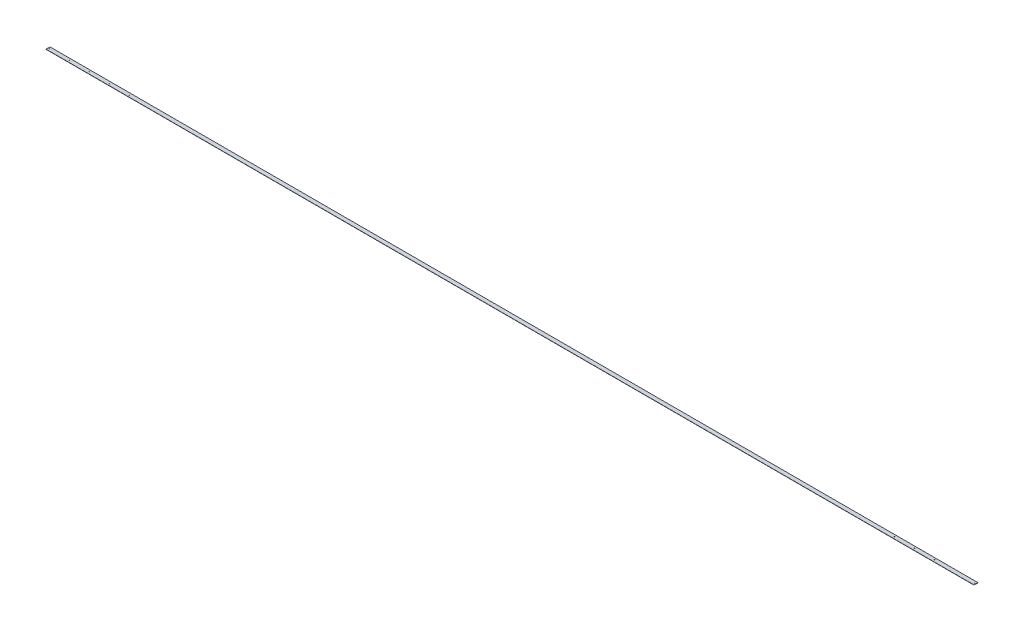
ISO-10303-21;
HEADER;
FILE_DESCRIPTION(('STEP AP214'),'2;1');
FILE_NAME('part.step','',(''),(''),'','','');
FILE_SCHEMA(('AUTOMOTIVE_DESIGN { 1 0 10303 214 1 1 1 1 }'));
ENDSEC;
DATA;
#1=APPLICATION_CONTEXT('core data for automotive mechanical design processes');
#2=APPLICATION_PROTOCOL_DEFINITION('international standard','automotive_design',2000,#1);
#3=PRODUCT_CONTEXT('',#1,'mechanical');
#4=PRODUCT('Part','Part','',(#3));
#5=PRODUCT_RELATED_PRODUCT_CATEGORY('part','',(#4));
#6=PRODUCT_DEFINITION_FORMATION('','',#4);
#7=PRODUCT_DEFINITION_CONTEXT('part definition',#1,'design');
#8=PRODUCT_DEFINITION('design','',#6,#7);
#9=PRODUCT_DEFINITION_SHAPE('','',#8);
#10=(LENGTH_UNIT() NAMED_UNIT(*) SI_UNIT(.MILLI.,.METRE.));
#11=(NAMED_UNIT(*) PLANE_ANGLE_UNIT() SI_UNIT($,.RADIAN.));
#12=(NAMED_UNIT(*) SI_UNIT($,.STERADIAN.) SOLID_ANGLE_UNIT());
#13=UNCERTAINTY_MEASURE_WITH_UNIT(LENGTH_MEASURE(1.E-05),#10,'distance_accuracy_value','');
#14=(GEOMETRIC_REPRESENTATION_CONTEXT(3) GLOBAL_UNCERTAINTY_ASSIGNED_CONTEXT((#13)) GLOBAL_UNIT_ASSIGNED_CONTEXT((#10,
#11,#12)) REPRESENTATION_CONTEXT('',''));
#15=CARTESIAN_POINT('',(0.,0.,0.));
#16=DIRECTION('',(0.,0.,1.));
#17=DIRECTION('',(1.,0.,0.));
#18=AXIS2_PLACEMENT_3D('',#15,#16,#17);
#19=CARTESIAN_POINT('',(-4925.,2.,21.0000000000006));
#20=DIRECTION('',(1.,0.,0.));
#21=DIRECTION('',(0.,0.,-1.));
#22=AXIS2_PLACEMENT_3D('',#19,#20,#21);
#23=PLANE('',#22);
#24=DIRECTION('',(0.,0.,1.));
#25=VECTOR('',#24,1.);
#26=CARTESIAN_POINT('',(-4925.,0.,21.0000000000006));
#27=LINE('',#26,#25);
#28=CARTESIAN_POINT('',(-4925.,0.,-20.9999999999994));
#29=VERTEX_POINT('',#28);
#30=CARTESIAN_POINT('',(-4925.,0.,21.0000000000006));
#31=VERTEX_POINT('',#30);
#32=EDGE_CURVE('E110',#29,#31,#27,.T.);
#33=ORIENTED_EDGE('',*,*,#32,.T.);
#34=DIRECTION('',(0.,-1.,0.));
#35=VECTOR('',#34,1.);
#36=CARTESIAN_POINT('',(-4925.,2.,21.0000000000006));
#37=LINE('',#36,#35);
#38=CARTESIAN_POINT('',(-4925.,2.,21.0000000000006));
#39=VERTEX_POINT('',#38);
#40=EDGE_CURVE('E11',#39,#31,#37,.T.);
#41=ORIENTED_EDGE('',*,*,#40,.F.);
#42=DIRECTION('',(0.,0.,1.));
#43=VECTOR('',#42,1.);
#44=CARTESIAN_POINT('',(-4925.,2.,21.0000000000006));
#45=LINE('',#44,#43);
#46=CARTESIAN_POINT('',(-4925.,2.,-20.9999999999994));
#47=VERTEX_POINT('',#46);
#48=EDGE_CURVE('E93',#47,#39,#45,.T.);
#49=ORIENTED_EDGE('',*,*,#48,.F.);
#50=DIRECTION('',(0.,-1.,0.));
#51=VECTOR('',#50,1.);
#52=CARTESIAN_POINT('',(-4925.,2.,-20.9999999999994));
#53=LINE('',#52,#51);
#54=EDGE_CURVE('E106',#47,#29,#53,.T.);
#55=ORIENTED_EDGE('',*,*,#54,.T.);
#56=EDGE_LOOP('',(#33,#41,#49,#55));
#57=FACE_BOUND('',#56,.T.);
#58=ADVANCED_FACE('F39',(#57),#23,.F.);
#59=CARTESIAN_POINT('',(4925.,2.,20.9999999999994));
#60=DIRECTION('',(0.,0.,-1.));
#61=DIRECTION('',(-1.,0.,0.));
#62=AXIS2_PLACEMENT_3D('',#59,#60,#61);
#63=PLANE('',#62);
#64=DIRECTION('',(1.,0.,0.));
#65=VECTOR('',#64,1.);
#66=CARTESIAN_POINT('',(4925.,0.,20.9999999999994));
#67=LINE('',#66,#65);
#68=CARTESIAN_POINT('',(4925.,0.,20.9999999999994));
#69=VERTEX_POINT('',#68);
#70=EDGE_CURVE('E98',#31,#69,#67,.T.);
#71=ORIENTED_EDGE('',*,*,#70,.T.);
#72=DIRECTION('',(0.,-1.,0.));
#73=VECTOR('',#72,1.);
#74=CARTESIAN_POINT('',(4925.,2.,20.9999999999994));
#75=LINE('',#74,#73);
#76=CARTESIAN_POINT('',(4925.,2.,20.9999999999994));
#77=VERTEX_POINT('',#76);
#78=EDGE_CURVE('E49',#77,#69,#75,.T.);
#79=ORIENTED_EDGE('',*,*,#78,.F.);
#80=DIRECTION('',(1.,0.,0.));
#81=VECTOR('',#80,1.);
#82=CARTESIAN_POINT('',(4925.,2.,20.9999999999994));
#83=LINE('',#82,#81);
#84=EDGE_CURVE('E88',#39,#77,#83,.T.);
#85=ORIENTED_EDGE('',*,*,#84,.F.);
#86=ORIENTED_EDGE('',*,*,#40,.T.);
#87=EDGE_LOOP('',(#71,#79,#85,#86));
#88=FACE_BOUND('',#87,.T.);
#89=ADVANCED_FACE('F97',(#88),#63,.F.);
#90=CARTESIAN_POINT('',(4925.,2.,20.9999999999994));
#91=DIRECTION('',(-1.,0.,0.));
#92=DIRECTION('',(0.,0.,1.));
#93=AXIS2_PLACEMENT_3D('',#90,#91,#92);
#94=PLANE('',#93);
#95=DIRECTION('',(0.,0.,-1.));
#96=VECTOR('',#95,1.);
#97=CARTESIAN_POINT('',(4925.,0.,20.9999999999994));
#98=LINE('',#97,#96);
#99=CARTESIAN_POINT('',(4925.,0.,-21.0000000000006));
#100=VERTEX_POINT('',#99);
#101=EDGE_CURVE('E75',#69,#100,#98,.T.);
#102=ORIENTED_EDGE('',*,*,#101,.T.);
#103=DIRECTION('',(0.,-1.,0.));
#104=VECTOR('',#103,1.);
#105=CARTESIAN_POINT('',(4925.,2.,-21.0000000000006));
#106=LINE('',#105,#104);
#107=CARTESIAN_POINT('',(4925.,2.,-21.0000000000006));
#108=VERTEX_POINT('',#107);
#109=EDGE_CURVE('E100',#108,#100,#106,.T.);
#110=ORIENTED_EDGE('',*,*,#109,.F.);
#111=DIRECTION('',(0.,0.,-1.));
#112=VECTOR('',#111,1.);
#113=CARTESIAN_POINT('',(4925.,2.,20.9999999999994));
#114=LINE('',#113,#112);
#115=EDGE_CURVE('E91',#77,#108,#114,.T.);
#116=ORIENTED_EDGE('',*,*,#115,.F.);
#117=ORIENTED_EDGE('',*,*,#78,.T.);
#118=EDGE_LOOP('',(#102,#110,#116,#117));
#119=FACE_BOUND('',#118,.T.);
#120=ADVANCED_FACE('F102',(#119),#94,.F.);
#121=CARTESIAN_POINT('',(4925.,2.,-21.0000000000006));
#122=DIRECTION('',(0.,0.,1.));
#123=DIRECTION('',(1.,0.,0.));
#124=AXIS2_PLACEMENT_3D('',#121,#122,#123);
#125=PLANE('',#124);
#126=DIRECTION('',(-1.,0.,0.));
#127=VECTOR('',#126,1.);
#128=CARTESIAN_POINT('',(4925.,0.,-21.0000000000006));
#129=LINE('',#128,#127);
#130=EDGE_CURVE('E81',#100,#29,#129,.T.);
#131=ORIENTED_EDGE('',*,*,#130,.T.);
#132=ORIENTED_EDGE('',*,*,#54,.F.);
#133=DIRECTION('',(-1.,0.,0.));
#134=VECTOR('',#133,1.);
#135=CARTESIAN_POINT('',(4925.,2.,-21.0000000000006));
#136=LINE('',#135,#134);
#137=EDGE_CURVE('E58',#108,#47,#136,.T.);
#138=ORIENTED_EDGE('',*,*,#137,.F.);
#139=ORIENTED_EDGE('',*,*,#109,.T.);
#140=EDGE_LOOP('',(#131,#132,#138,#139));
#141=FACE_BOUND('',#140,.T.);
#142=ADVANCED_FACE('F196',(#141),#125,.F.);
#143=CARTESIAN_POINT('',(0.,2.,0.));
#144=DIRECTION('',(0.,1.,0.));
#145=DIRECTION('',(0.,0.,1.));
#146=AXIS2_PLACEMENT_3D('',#143,#144,#145);
#147=PLANE('',#146);
#148=CARTESIAN_POINT('',(-4910.,2.,1.00000000000061));
#149=DIRECTION('',(0.,1.,0.));
#150=DIRECTION('',(0.,0.,1.));
#151=AXIS2_PLACEMENT_3D('',#148,#149,#150);
#152=CIRCLE('',#151,3.40000000000035);
#153=CARTESIAN_POINT('',(-4910.,2.,4.40000000000096));
#154=VERTEX_POINT('',#153);
#155=EDGE_CURVE('E129',#154,#154,#152,.T.);
#156=ORIENTED_EDGE('',*,*,#155,.F.);
#157=EDGE_LOOP('',(#156));
#158=FACE_BOUND('',#157,.T.);
#159=CARTESIAN_POINT('',(4060.,2.,1.00000000000654));
#160=DIRECTION('',(0.,1.,0.));
#161=DIRECTION('',(0.,0.,1.));
#162=AXIS2_PLACEMENT_3D('',#159,#160,#161);
#163=CIRCLE('',#162,3.40000000000035);
#164=CARTESIAN_POINT('',(4060.,2.,4.40000000000689));
#165=VERTEX_POINT('',#164);
#166=EDGE_CURVE('E337',#165,#165,#163,.T.);
#167=ORIENTED_EDGE('',*,*,#166,.F.);
#168=EDGE_LOOP('',(#167));
#169=FACE_BOUND('',#168,.T.);
#170=CARTESIAN_POINT('',(4272.5,2.,1.00000000000506));
#171=DIRECTION('',(0.,1.,0.));
#172=DIRECTION('',(0.,0.,1.));
#173=AXIS2_PLACEMENT_3D('',#170,#171,#172);
#174=CIRCLE('',#173,3.40000000000035);
#175=CARTESIAN_POINT('',(4272.5,2.,4.40000000000541));
#176=VERTEX_POINT('',#175);
#177=EDGE_CURVE('E310',#176,#176,#174,.T.);
#178=ORIENTED_EDGE('',*,*,#177,.F.);
#179=EDGE_LOOP('',(#178));
#180=FACE_BOUND('',#179,.T.);
#181=CARTESIAN_POINT('',(4485.,2.,1.00000000000358));
#182=DIRECTION('',(0.,1.,0.));
#183=DIRECTION('',(0.,0.,1.));
#184=AXIS2_PLACEMENT_3D('',#181,#182,#183);
#185=CIRCLE('',#184,3.40000000000035);
#186=CARTESIAN_POINT('',(4485.,2.,4.40000000000393));
#187=VERTEX_POINT('',#186);
#188=EDGE_CURVE('E336',#187,#187,#185,.T.);
#189=ORIENTED_EDGE('',*,*,#188,.F.);
#190=EDGE_LOOP('',(#189));
#191=FACE_BOUND('',#190,.T.);
#192=CARTESIAN_POINT('',(4697.5,2.,1.00000000000209));
#193=DIRECTION('',(0.,1.,0.));
#194=DIRECTION('',(0.,0.,1.));
#195=AXIS2_PLACEMENT_3D('',#192,#193,#194);
#196=CIRCLE('',#195,3.40000000000035);
#197=CARTESIAN_POINT('',(4697.5,2.,4.40000000000244));
#198=VERTEX_POINT('',#197);
#199=EDGE_CURVE('E342',#198,#198,#196,.T.);
#200=ORIENTED_EDGE('',*,*,#199,.F.);
#201=EDGE_LOOP('',(#200));
#202=FACE_BOUND('',#201,.T.);
#203=CARTESIAN_POINT('',(4910.,2.,1.00000000000061));
#204=DIRECTION('',(0.,1.,0.));
#205=DIRECTION('',(0.,0.,1.));
#206=AXIS2_PLACEMENT_3D('',#203,#204,#205);
#207=CIRCLE('',#206,3.40000000000035);
#208=CARTESIAN_POINT('',(4910.,2.,4.40000000000096));
#209=VERTEX_POINT('',#208);
#210=EDGE_CURVE('E351',#209,#209,#207,.T.);
#211=ORIENTED_EDGE('',*,*,#210,.F.);
#212=EDGE_LOOP('',(#211));
#213=FACE_BOUND('',#212,.T.);
#214=CARTESIAN_POINT('',(-4060.,2.,1.00000000000061));
#215=DIRECTION('',(0.,1.,0.));
#216=DIRECTION('',(0.,0.,1.));
#217=AXIS2_PLACEMENT_3D('',#214,#215,#216);
#218=CIRCLE('',#217,3.40000000000035);
#219=CARTESIAN_POINT('',(-4060.,2.,4.40000000000096));
#220=VERTEX_POINT('',#219);
#221=EDGE_CURVE('E355',#220,#220,#218,.T.);
#222=ORIENTED_EDGE('',*,*,#221,.F.);
#223=EDGE_LOOP('',(#222));
#224=FACE_BOUND('',#223,.T.);
#225=CARTESIAN_POINT('',(-4272.5,2.,1.00000000000061));
#226=DIRECTION('',(0.,1.,0.));
#227=DIRECTION('',(0.,0.,1.));
#228=AXIS2_PLACEMENT_3D('',#225,#226,#227);
#229=CIRCLE('',#228,3.40000000000035);
#230=CARTESIAN_POINT('',(-4272.5,2.,4.40000000000096));
#231=VERTEX_POINT('',#230);
#232=EDGE_CURVE('E359',#231,#231,#229,.T.);
#233=ORIENTED_EDGE('',*,*,#232,.F.);
#234=EDGE_LOOP('',(#233));
#235=FACE_BOUND('',#234,.T.);
#236=CARTESIAN_POINT('',(-4485.,2.,1.00000000000061));
#237=DIRECTION('',(0.,1.,0.));
#238=DIRECTION('',(0.,0.,1.));
#239=AXIS2_PLACEMENT_3D('',#236,#237,#238);
#240=CIRCLE('',#239,3.40000000000035);
#241=CARTESIAN_POINT('',(-4485.,2.,4.40000000000096));
#242=VERTEX_POINT('',#241);
#243=EDGE_CURVE('E363',#242,#242,#240,.T.);
#244=ORIENTED_EDGE('',*,*,#243,.F.);
#245=EDGE_LOOP('',(#244));
#246=FACE_BOUND('',#245,.T.);
#247=CARTESIAN_POINT('',(-4697.5,2.,1.00000000000061));
#248=DIRECTION('',(0.,1.,0.));
#249=DIRECTION('',(0.,0.,1.));
#250=AXIS2_PLACEMENT_3D('',#247,#248,#249);
#251=CIRCLE('',#250,3.40000000000035);
#252=CARTESIAN_POINT('',(-4697.5,2.,4.40000000000096));
#253=VERTEX_POINT('',#252);
#254=EDGE_CURVE('E367',#253,#253,#251,.T.);
#255=ORIENTED_EDGE('',*,*,#254,.F.);
#256=EDGE_LOOP('',(#255));
#257=FACE_BOUND('',#256,.T.);
#258=ORIENTED_EDGE('',*,*,#48,.T.);
#259=ORIENTED_EDGE('',*,*,#84,.T.);
#260=ORIENTED_EDGE('',*,*,#115,.T.);
#261=ORIENTED_EDGE('',*,*,#137,.T.);
#262=EDGE_LOOP('',(#258,#259,#260,#261));
#263=FACE_BOUND('',#262,.T.);
#264=ADVANCED_FACE('F89',(#158,#169,#180,#191,#202,#213,#224,#235,#246,#257,#263),#147,.T.);
#265=CARTESIAN_POINT('',(0.,0.,0.));
#266=DIRECTION('',(0.,1.,0.));
#267=DIRECTION('',(0.,0.,1.));
#268=AXIS2_PLACEMENT_3D('',#265,#266,#267);
#269=PLANE('',#268);
#270=CARTESIAN_POINT('',(-4910.,0.,1.00000000000061));
#271=DIRECTION('',(0.,1.,0.));
#272=DIRECTION('',(0.,0.,1.));
#273=AXIS2_PLACEMENT_3D('',#270,#271,#272);
#274=CIRCLE('',#273,3.40000000000035);
#275=CARTESIAN_POINT('',(-4910.,0.,4.40000000000096));
#276=VERTEX_POINT('',#275);
#277=EDGE_CURVE('E42',#276,#276,#274,.T.);
#278=ORIENTED_EDGE('',*,*,#277,.T.);
#279=EDGE_LOOP('',(#278));
#280=FACE_BOUND('',#279,.T.);
#281=CARTESIAN_POINT('',(4060.,0.,1.00000000000654));
#282=DIRECTION('',(0.,1.,0.));
#283=DIRECTION('',(0.,0.,1.));
#284=AXIS2_PLACEMENT_3D('',#281,#282,#283);
#285=CIRCLE('',#284,3.40000000000035);
#286=CARTESIAN_POINT('',(4060.,0.,4.40000000000689));
#287=VERTEX_POINT('',#286);
#288=EDGE_CURVE('E156',#287,#287,#285,.T.);
#289=ORIENTED_EDGE('',*,*,#288,.T.);
#290=EDGE_LOOP('',(#289));
#291=FACE_BOUND('',#290,.T.);
#292=CARTESIAN_POINT('',(4272.5,0.,1.00000000000506));
#293=DIRECTION('',(0.,1.,0.));
#294=DIRECTION('',(0.,0.,1.));
#295=AXIS2_PLACEMENT_3D('',#292,#293,#294);
#296=CIRCLE('',#295,3.40000000000035);
#297=CARTESIAN_POINT('',(4272.5,0.,4.40000000000541));
#298=VERTEX_POINT('',#297);
#299=EDGE_CURVE('E153',#298,#298,#296,.T.);
#300=ORIENTED_EDGE('',*,*,#299,.T.);
#301=EDGE_LOOP('',(#300));
#302=FACE_BOUND('',#301,.T.);
#303=CARTESIAN_POINT('',(4485.,0.,1.00000000000358));
#304=DIRECTION('',(0.,1.,0.));
#305=DIRECTION('',(0.,0.,1.));
#306=AXIS2_PLACEMENT_3D('',#303,#304,#305);
#307=CIRCLE('',#306,3.40000000000035);
#308=CARTESIAN_POINT('',(4485.,0.,4.40000000000393));
#309=VERTEX_POINT('',#308);
#310=EDGE_CURVE('E149',#309,#309,#307,.T.);
#311=ORIENTED_EDGE('',*,*,#310,.T.);
#312=EDGE_LOOP('',(#311));
#313=FACE_BOUND('',#312,.T.);
#314=CARTESIAN_POINT('',(4697.5,0.,1.00000000000209));
#315=DIRECTION('',(0.,1.,0.));
#316=DIRECTION('',(0.,0.,1.));
#317=AXIS2_PLACEMENT_3D('',#314,#315,#316);
#318=CIRCLE('',#317,3.40000000000035);
#319=CARTESIAN_POINT('',(4697.5,0.,4.40000000000244));
#320=VERTEX_POINT('',#319);
#321=EDGE_CURVE('E145',#320,#320,#318,.T.);
#322=ORIENTED_EDGE('',*,*,#321,.T.);
#323=EDGE_LOOP('',(#322));
#324=FACE_BOUND('',#323,.T.);
#325=CARTESIAN_POINT('',(4910.,0.,1.00000000000061));
#326=DIRECTION('',(0.,1.,0.));
#327=DIRECTION('',(0.,0.,1.));
#328=AXIS2_PLACEMENT_3D('',#325,#326,#327);
#329=CIRCLE('',#328,3.40000000000035);
#330=CARTESIAN_POINT('',(4910.,0.,4.40000000000096));
#331=VERTEX_POINT('',#330);
#332=EDGE_CURVE('E141',#331,#331,#329,.T.);
#333=ORIENTED_EDGE('',*,*,#332,.T.);
#334=EDGE_LOOP('',(#333));
#335=FACE_BOUND('',#334,.T.);
#336=CARTESIAN_POINT('',(-4060.,0.,1.00000000000061));
#337=DIRECTION('',(0.,1.,0.));
#338=DIRECTION('',(0.,0.,1.));
#339=AXIS2_PLACEMENT_3D('',#336,#337,#338);
#340=CIRCLE('',#339,3.40000000000035);
#341=CARTESIAN_POINT('',(-4060.,0.,4.40000000000096));
#342=VERTEX_POINT('',#341);
#343=EDGE_CURVE('E137',#342,#342,#340,.T.);
#344=ORIENTED_EDGE('',*,*,#343,.T.);
#345=EDGE_LOOP('',(#344));
#346=FACE_BOUND('',#345,.T.);
#347=CARTESIAN_POINT('',(-4272.5,0.,1.00000000000061));
#348=DIRECTION('',(0.,1.,0.));
#349=DIRECTION('',(0.,0.,1.));
#350=AXIS2_PLACEMENT_3D('',#347,#348,#349);
#351=CIRCLE('',#350,3.40000000000035);
#352=CARTESIAN_POINT('',(-4272.5,0.,4.40000000000096));
#353=VERTEX_POINT('',#352);
#354=EDGE_CURVE('E133',#353,#353,#351,.T.);
#355=ORIENTED_EDGE('',*,*,#354,.T.);
#356=EDGE_LOOP('',(#355));
#357=FACE_BOUND('',#356,.T.);
#358=CARTESIAN_POINT('',(-4485.,0.,1.00000000000061));
#359=DIRECTION('',(0.,1.,0.));
#360=DIRECTION('',(0.,0.,1.));
#361=AXIS2_PLACEMENT_3D('',#358,#359,#360);
#362=CIRCLE('',#361,3.40000000000035);
#363=CARTESIAN_POINT('',(-4485.,0.,4.40000000000096));
#364=VERTEX_POINT('',#363);
#365=EDGE_CURVE('E128',#364,#364,#362,.T.);
#366=ORIENTED_EDGE('',*,*,#365,.T.);
#367=EDGE_LOOP('',(#366));
#368=FACE_BOUND('',#367,.T.);
#369=CARTESIAN_POINT('',(-4697.5,0.,1.00000000000061));
#370=DIRECTION('',(0.,1.,0.));
#371=DIRECTION('',(0.,0.,1.));
#372=AXIS2_PLACEMENT_3D('',#369,#370,#371);
#373=CIRCLE('',#372,3.40000000000035);
#374=CARTESIAN_POINT('',(-4697.5,0.,4.40000000000096));
#375=VERTEX_POINT('',#374);
#376=EDGE_CURVE('E124',#375,#375,#373,.T.);
#377=ORIENTED_EDGE('',*,*,#376,.T.);
#378=EDGE_LOOP('',(#377));
#379=FACE_BOUND('',#378,.T.);
#380=ORIENTED_EDGE('',*,*,#32,.F.);
#381=ORIENTED_EDGE('',*,*,#130,.F.);
#382=ORIENTED_EDGE('',*,*,#101,.F.);
#383=ORIENTED_EDGE('',*,*,#70,.F.);
#384=EDGE_LOOP('',(#380,#381,#382,#383));
#385=FACE_BOUND('',#384,.T.);
#386=ADVANCED_FACE('F165',(#280,#291,#302,#313,#324,#335,#346,#357,#368,#379,#385),#269,.F.);
#387=CARTESIAN_POINT('',(-4697.5,-8.,1.00000000000061));
#388=DIRECTION('',(0.,1.,0.));
#389=DIRECTION('',(0.,0.,1.));
#390=AXIS2_PLACEMENT_3D('',#387,#388,#389);
#391=CYLINDRICAL_SURFACE('',#390,3.40000000000035);
#392=ORIENTED_EDGE('',*,*,#254,.T.);
#393=EDGE_LOOP('',(#392));
#394=FACE_BOUND('',#393,.T.);
#395=ORIENTED_EDGE('',*,*,#376,.F.);
#396=EDGE_LOOP('',(#395));
#397=FACE_BOUND('',#396,.T.);
#398=ADVANCED_FACE('F187',(#394,#397),#391,.F.);
#399=CARTESIAN_POINT('',(-4485.,-8.,1.00000000000061));
#400=DIRECTION('',(0.,1.,0.));
#401=DIRECTION('',(0.,0.,1.));
#402=AXIS2_PLACEMENT_3D('',#399,#400,#401);
#403=CYLINDRICAL_SURFACE('',#402,3.40000000000035);
#404=ORIENTED_EDGE('',*,*,#243,.T.);
#405=EDGE_LOOP('',(#404));
#406=FACE_BOUND('',#405,.T.);
#407=ORIENTED_EDGE('',*,*,#365,.F.);
#408=EDGE_LOOP('',(#407));
#409=FACE_BOUND('',#408,.T.);
#410=ADVANCED_FACE('F193',(#406,#409),#403,.F.);
#411=CARTESIAN_POINT('',(-4272.5,-8.,1.00000000000061));
#412=DIRECTION('',(0.,1.,0.));
#413=DIRECTION('',(0.,0.,1.));
#414=AXIS2_PLACEMENT_3D('',#411,#412,#413);
#415=CYLINDRICAL_SURFACE('',#414,3.40000000000035);
#416=ORIENTED_EDGE('',*,*,#232,.T.);
#417=EDGE_LOOP('',(#416));
#418=FACE_BOUND('',#417,.T.);
#419=ORIENTED_EDGE('',*,*,#354,.F.);
#420=EDGE_LOOP('',(#419));
#421=FACE_BOUND('',#420,.T.);
#422=ADVANCED_FACE('F235',(#418,#421),#415,.F.);
#423=CARTESIAN_POINT('',(-4060.,-8.,1.00000000000061));
#424=DIRECTION('',(0.,1.,0.));
#425=DIRECTION('',(0.,0.,1.));
#426=AXIS2_PLACEMENT_3D('',#423,#424,#425);
#427=CYLINDRICAL_SURFACE('',#426,3.40000000000035);
#428=ORIENTED_EDGE('',*,*,#221,.T.);
#429=EDGE_LOOP('',(#428));
#430=FACE_BOUND('',#429,.T.);
#431=ORIENTED_EDGE('',*,*,#343,.F.);
#432=EDGE_LOOP('',(#431));
#433=FACE_BOUND('',#432,.T.);
#434=ADVANCED_FACE('F245',(#430,#433),#427,.F.);
#435=CARTESIAN_POINT('',(4910.,-8.,1.00000000000061));
#436=DIRECTION('',(0.,1.,0.));
#437=DIRECTION('',(0.,0.,1.));
#438=AXIS2_PLACEMENT_3D('',#435,#436,#437);
#439=CYLINDRICAL_SURFACE('',#438,3.40000000000035);
#440=ORIENTED_EDGE('',*,*,#210,.T.);
#441=EDGE_LOOP('',(#440));
#442=FACE_BOUND('',#441,.T.);
#443=ORIENTED_EDGE('',*,*,#332,.F.);
#444=EDGE_LOOP('',(#443));
#445=FACE_BOUND('',#444,.T.);
#446=ADVANCED_FACE('F255',(#442,#445),#439,.F.);
#447=CARTESIAN_POINT('',(4697.5,-8.,1.00000000000209));
#448=DIRECTION('',(0.,1.,0.));
#449=DIRECTION('',(0.,0.,1.));
#450=AXIS2_PLACEMENT_3D('',#447,#448,#449);
#451=CYLINDRICAL_SURFACE('',#450,3.40000000000035);
#452=ORIENTED_EDGE('',*,*,#199,.T.);
#453=EDGE_LOOP('',(#452));
#454=FACE_BOUND('',#453,.T.);
#455=ORIENTED_EDGE('',*,*,#321,.F.);
#456=EDGE_LOOP('',(#455));
#457=FACE_BOUND('',#456,.T.);
#458=ADVANCED_FACE('F265',(#454,#457),#451,.F.);
#459=CARTESIAN_POINT('',(4485.,-8.,1.00000000000358));
#460=DIRECTION('',(0.,1.,0.));
#461=DIRECTION('',(0.,0.,1.));
#462=AXIS2_PLACEMENT_3D('',#459,#460,#461);
#463=CYLINDRICAL_SURFACE('',#462,3.40000000000035);
#464=ORIENTED_EDGE('',*,*,#188,.T.);
#465=EDGE_LOOP('',(#464));
#466=FACE_BOUND('',#465,.T.);
#467=ORIENTED_EDGE('',*,*,#310,.F.);
#468=EDGE_LOOP('',(#467));
#469=FACE_BOUND('',#468,.T.);
#470=ADVANCED_FACE('F275',(#466,#469),#463,.F.);
#471=CARTESIAN_POINT('',(4272.5,-8.,1.00000000000506));
#472=DIRECTION('',(0.,1.,0.));
#473=DIRECTION('',(0.,0.,1.));
#474=AXIS2_PLACEMENT_3D('',#471,#472,#473);
#475=CYLINDRICAL_SURFACE('',#474,3.40000000000035);
#476=ORIENTED_EDGE('',*,*,#177,.T.);
#477=EDGE_LOOP('',(#476));
#478=FACE_BOUND('',#477,.T.);
#479=ORIENTED_EDGE('',*,*,#299,.F.);
#480=EDGE_LOOP('',(#479));
#481=FACE_BOUND('',#480,.T.);
#482=ADVANCED_FACE('F175',(#478,#481),#475,.F.);
#483=CARTESIAN_POINT('',(4060.,-8.,1.00000000000654));
#484=DIRECTION('',(0.,1.,0.));
#485=DIRECTION('',(0.,0.,1.));
#486=AXIS2_PLACEMENT_3D('',#483,#484,#485);
#487=CYLINDRICAL_SURFACE('',#486,3.40000000000035);
#488=ORIENTED_EDGE('',*,*,#166,.T.);
#489=EDGE_LOOP('',(#488));
#490=FACE_BOUND('',#489,.T.);
#491=ORIENTED_EDGE('',*,*,#288,.F.);
#492=EDGE_LOOP('',(#491));
#493=FACE_BOUND('',#492,.T.);
#494=ADVANCED_FACE('F169',(#490,#493),#487,.F.);
#495=CARTESIAN_POINT('',(-4910.,-8.,1.00000000000061));
#496=DIRECTION('',(0.,1.,0.));
#497=DIRECTION('',(0.,0.,1.));
#498=AXIS2_PLACEMENT_3D('',#495,#496,#497);
#499=CYLINDRICAL_SURFACE('',#498,3.40000000000035);
#500=ORIENTED_EDGE('',*,*,#155,.T.);
#501=EDGE_LOOP('',(#500));
#502=FACE_BOUND('',#501,.T.);
#503=ORIENTED_EDGE('',*,*,#277,.F.);
#504=EDGE_LOOP('',(#503));
#505=FACE_BOUND('',#504,.T.);
#506=ADVANCED_FACE('F167',(#502,#505),#499,.F.);
#507=CLOSED_SHELL('',(#58,#89,#120,#142,#264,#386,#398,#410,#422,#434,#446,#458,#470,#482,#494,#506));
#508=MANIFOLD_SOLID_BREP('B2',#507);
#509=ADVANCED_BREP_SHAPE_REPRESENTATION('',(#18,#508),#14);
#510=SHAPE_DEFINITION_REPRESENTATION(#9,#509);
ENDSEC;
END-ISO-10303-21;
